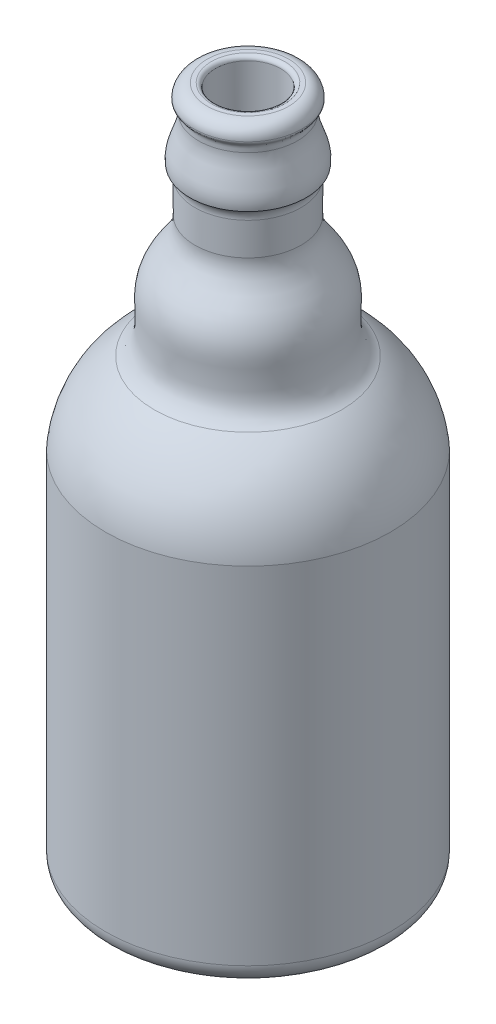
ISO-10303-21;
HEADER;
FILE_DESCRIPTION(('STEP AP214'),'2;1');
FILE_NAME('part.step','',(''),(''),'','','');
FILE_SCHEMA(('AUTOMOTIVE_DESIGN { 1 0 10303 214 1 1 1 1 }'));
ENDSEC;
DATA;
#1=APPLICATION_CONTEXT('core data for automotive mechanical design processes');
#2=APPLICATION_PROTOCOL_DEFINITION('international standard','automotive_design',2000,#1);
#3=PRODUCT_CONTEXT('',#1,'mechanical');
#4=PRODUCT('Part','Part','',(#3));
#5=PRODUCT_RELATED_PRODUCT_CATEGORY('part','',(#4));
#6=PRODUCT_DEFINITION_FORMATION('','',#4);
#7=PRODUCT_DEFINITION_CONTEXT('part definition',#1,'design');
#8=PRODUCT_DEFINITION('design','',#6,#7);
#9=PRODUCT_DEFINITION_SHAPE('','',#8);
#10=(LENGTH_UNIT() NAMED_UNIT(*) SI_UNIT(.MILLI.,.METRE.));
#11=(NAMED_UNIT(*) PLANE_ANGLE_UNIT() SI_UNIT($,.RADIAN.));
#12=(NAMED_UNIT(*) SI_UNIT($,.STERADIAN.) SOLID_ANGLE_UNIT());
#13=UNCERTAINTY_MEASURE_WITH_UNIT(LENGTH_MEASURE(1.E-05),#10,'distance_accuracy_value','');
#14=(GEOMETRIC_REPRESENTATION_CONTEXT(3) GLOBAL_UNCERTAINTY_ASSIGNED_CONTEXT((#13)) GLOBAL_UNIT_ASSIGNED_CONTEXT((#10,
#11,#12)) REPRESENTATION_CONTEXT('',''));
#15=CARTESIAN_POINT('',(0.,0.,0.));
#16=DIRECTION('',(0.,0.,1.));
#17=DIRECTION('',(1.,0.,0.));
#18=AXIS2_PLACEMENT_3D('',#15,#16,#17);
#19=CARTESIAN_POINT('',(0.,0.,0.));
#20=DIRECTION('',(0.,-1.,0.));
#21=DIRECTION('',(0.,0.,-1.));
#22=AXIS2_PLACEMENT_3D('',#19,#20,#21);
#23=PLANE('',#22);
#24=CARTESIAN_POINT('',(0.,0.,0.));
#25=DIRECTION('',(0.,1.,0.));
#26=DIRECTION('',(0.,0.,1.));
#27=AXIS2_PLACEMENT_3D('',#24,#25,#26);
#28=CIRCLE('',#27,30.);
#29=CARTESIAN_POINT('',(0.,0.,30.));
#30=VERTEX_POINT('',#29);
#31=EDGE_CURVE('E48',#30,#30,#28,.T.);
#32=ORIENTED_EDGE('',*,*,#31,.F.);
#33=EDGE_LOOP('',(#32));
#34=FACE_BOUND('',#33,.T.);
#35=ADVANCED_FACE('F37',(#34),#23,.T.);
#36=CARTESIAN_POINT('',(0.,5.,0.));
#37=DIRECTION('',(0.,1.,0.));
#38=DIRECTION('',(0.,0.,1.));
#39=AXIS2_PLACEMENT_3D('',#36,#37,#38);
#40=TOROIDAL_SURFACE('',#39,30.,5.);
#41=ORIENTED_EDGE('',*,*,#31,.T.);
#42=EDGE_LOOP('',(#41));
#43=FACE_BOUND('',#42,.T.);
#44=CARTESIAN_POINT('',(0.,5.,0.));
#45=DIRECTION('',(0.,1.,0.));
#46=DIRECTION('',(0.,0.,1.));
#47=AXIS2_PLACEMENT_3D('',#44,#45,#46);
#48=CIRCLE('',#47,35.);
#49=CARTESIAN_POINT('',(0.,5.,35.));
#50=VERTEX_POINT('',#49);
#51=EDGE_CURVE('E52',#50,#50,#48,.T.);
#52=ORIENTED_EDGE('',*,*,#51,.F.);
#53=EDGE_LOOP('',(#52));
#54=FACE_BOUND('',#53,.T.);
#55=ADVANCED_FACE('F114',(#43,#54),#40,.T.);
#56=CARTESIAN_POINT('',(0.,90.,0.));
#57=DIRECTION('',(0.,1.,0.));
#58=DIRECTION('',(0.,0.,1.));
#59=AXIS2_PLACEMENT_3D('',#56,#57,#58);
#60=CYLINDRICAL_SURFACE('',#59,35.);
#61=ORIENTED_EDGE('',*,*,#51,.T.);
#62=EDGE_LOOP('',(#61));
#63=FACE_BOUND('',#62,.T.);
#64=CARTESIAN_POINT('',(0.,90.,0.));
#65=DIRECTION('',(0.,1.,0.));
#66=DIRECTION('',(0.,0.,1.));
#67=AXIS2_PLACEMENT_3D('',#64,#65,#66);
#68=CIRCLE('',#67,35.);
#69=CARTESIAN_POINT('',(0.,90.,35.));
#70=VERTEX_POINT('',#69);
#71=EDGE_CURVE('E57',#70,#70,#68,.T.);
#72=ORIENTED_EDGE('',*,*,#71,.F.);
#73=EDGE_LOOP('',(#72));
#74=FACE_BOUND('',#73,.T.);
#75=ADVANCED_FACE('F110',(#63,#74),#60,.T.);
#76=CARTESIAN_POINT('',(0.,87.4712096260136,0.));
#77=DIRECTION('',(0.,1.,0.));
#78=DIRECTION('',(0.,0.,1.));
#79=AXIS2_PLACEMENT_3D('',#76,#77,#78);
#80=DEGENERATE_TOROIDAL_SURFACE('',#79,8.11868271002269,27.,.T.);
#81=ORIENTED_EDGE('',*,*,#71,.T.);
#82=EDGE_LOOP('',(#81));
#83=FACE_BOUND('',#82,.T.);
#84=CARTESIAN_POINT('',(0.,110.,0.));
#85=DIRECTION('',(0.,1.,0.));
#86=DIRECTION('',(0.,0.,1.));
#87=AXIS2_PLACEMENT_3D('',#84,#85,#86);
#88=CIRCLE('',#87,23.);
#89=CARTESIAN_POINT('',(0.,110.,23.));
#90=VERTEX_POINT('',#89);
#91=EDGE_CURVE('E60',#90,#90,#88,.T.);
#92=ORIENTED_EDGE('',*,*,#91,.F.);
#93=EDGE_LOOP('',(#92));
#94=FACE_BOUND('',#93,.T.);
#95=ADVANCED_FACE('F107',(#83,#94),#80,.T.);
#96=CARTESIAN_POINT('',(-13.,140.,0.));
#97=CARTESIAN_POINT('',(-12.7045310236833,136.13846316977,0.));
#98=CARTESIAN_POINT('',(-16.980222856119,132.156503830218,0.));
#99=CARTESIAN_POINT('',(-21.335513144288,122.025640538508,0.));
#100=CARTESIAN_POINT('',(-17.7844927531869,113.060883508352,0.));
#101=CARTESIAN_POINT('',(-23.,110.,0.));
#102=B_SPLINE_CURVE_WITH_KNOTS('',3,(#96,#97,#98,#99,#100,#101),.UNSPECIFIED.,.F.,.F.,(4,1,1,4),
(0.,0.315463765755963,0.514986069302217,1.),.UNSPECIFIED.);
#103=CARTESIAN_POINT('',(0.,140.,0.));
#104=DIRECTION('',(0.,1.,0.));
#105=AXIS1_PLACEMENT('',#103,#104);
#106=SURFACE_OF_REVOLUTION('',#102,#105);
#107=ORIENTED_EDGE('',*,*,#91,.T.);
#108=EDGE_LOOP('',(#107));
#109=FACE_BOUND('',#108,.T.);
#110=CARTESIAN_POINT('',(0.,140.,0.));
#111=DIRECTION('',(0.,1.,0.));
#112=DIRECTION('',(0.,0.,1.));
#113=AXIS2_PLACEMENT_3D('',#110,#111,#112);
#114=CIRCLE('',#113,13.);
#115=CARTESIAN_POINT('',(0.,140.,13.));
#116=VERTEX_POINT('',#115);
#117=EDGE_CURVE('E63',#116,#116,#114,.T.);
#118=ORIENTED_EDGE('',*,*,#117,.F.);
#119=EDGE_LOOP('',(#118));
#120=FACE_BOUND('',#119,.T.);
#121=ADVANCED_FACE('F105',(#109,#120),#106,.F.);
#122=CARTESIAN_POINT('',(0.,0.,0.));
#123=DIRECTION('',(0.,-1.,0.));
#124=DIRECTION('',(0.,0.,-1.));
#125=AXIS2_PLACEMENT_3D('',#122,#123,#124);
#126=CYLINDRICAL_SURFACE('',#125,13.);
#127=ORIENTED_EDGE('',*,*,#117,.T.);
#128=EDGE_LOOP('',(#127));
#129=FACE_BOUND('',#128,.T.);
#130=CARTESIAN_POINT('',(0.,148.,0.));
#131=DIRECTION('',(0.,-1.,0.));
#132=DIRECTION('',(0.,0.,-1.));
#133=AXIS2_PLACEMENT_3D('',#130,#131,#132);
#134=CIRCLE('',#133,13.);
#135=CARTESIAN_POINT('',(0.,148.,-13.));
#136=VERTEX_POINT('',#135);
#137=EDGE_CURVE('E66',#136,#136,#134,.T.);
#138=ORIENTED_EDGE('',*,*,#137,.T.);
#139=EDGE_LOOP('',(#138));
#140=FACE_BOUND('',#139,.T.);
#141=ADVANCED_FACE('F102',(#129,#140),#126,.T.);
#142=CARTESIAN_POINT('',(-14.3,150.775307346881,0.));
#143=CARTESIAN_POINT('',(-13.3308215452361,150.260847857195,0.));
#144=CARTESIAN_POINT('',(-12.9332480961433,149.041422290289,0.));
#145=CARTESIAN_POINT('',(-13.,148.,0.));
#146=B_SPLINE_CURVE_WITH_KNOTS('',3,(#142,#143,#144,#145),.UNSPECIFIED.,.F.,.F.,(4,4),(0.,1.),.UNSPECIFIED.);
#147=CARTESIAN_POINT('',(0.,148.,0.));
#148=DIRECTION('',(0.,-1.,0.));
#149=AXIS1_PLACEMENT('',#147,#148);
#150=SURFACE_OF_REVOLUTION('',#146,#149);
#151=ORIENTED_EDGE('',*,*,#137,.F.);
#152=EDGE_LOOP('',(#151));
#153=FACE_BOUND('',#152,.T.);
#154=CARTESIAN_POINT('',(0.,150.775307346881,0.));
#155=DIRECTION('',(0.,-1.,0.));
#156=DIRECTION('',(0.,0.,-1.));
#157=AXIS2_PLACEMENT_3D('',#154,#155,#156);
#158=CIRCLE('',#157,14.3);
#159=CARTESIAN_POINT('',(0.,150.775307346881,-14.3));
#160=VERTEX_POINT('',#159);
#161=EDGE_CURVE('E69',#160,#160,#158,.T.);
#162=ORIENTED_EDGE('',*,*,#161,.T.);
#163=EDGE_LOOP('',(#162));
#164=FACE_BOUND('',#163,.T.);
#165=ADVANCED_FACE('F99',(#153,#164),#150,.T.);
#166=CARTESIAN_POINT('',(-12.15,161.790763582258,0.));
#167=CARTESIAN_POINT('',(-12.0816044927341,157.916507354345,0.));
#168=CARTESIAN_POINT('',(-14.9925105292028,154.778829423521,0.));
#169=CARTESIAN_POINT('',(-14.3,150.775307346881,0.));
#170=B_SPLINE_CURVE_WITH_KNOTS('',3,(#166,#167,#168,#169),.UNSPECIFIED.,.F.,.F.,(4,4),(0.,1.),.UNSPECIFIED.);
#171=CARTESIAN_POINT('',(0.,148.,0.));
#172=DIRECTION('',(0.,-1.,0.));
#173=AXIS1_PLACEMENT('',#171,#172);
#174=SURFACE_OF_REVOLUTION('',#170,#173);
#175=ORIENTED_EDGE('',*,*,#161,.F.);
#176=EDGE_LOOP('',(#175));
#177=FACE_BOUND('',#176,.T.);
#178=CARTESIAN_POINT('',(0.,161.790763582258,0.));
#179=DIRECTION('',(0.,-1.,0.));
#180=DIRECTION('',(0.,0.,-1.));
#181=AXIS2_PLACEMENT_3D('',#178,#179,#180);
#182=CIRCLE('',#181,12.15);
#183=CARTESIAN_POINT('',(0.,161.790763582258,-12.15));
#184=VERTEX_POINT('',#183);
#185=EDGE_CURVE('E72',#184,#184,#182,.T.);
#186=ORIENTED_EDGE('',*,*,#185,.T.);
#187=EDGE_LOOP('',(#186));
#188=FACE_BOUND('',#187,.T.);
#189=ADVANCED_FACE('F94',(#177,#188),#174,.T.);
#190=CARTESIAN_POINT('',(-13.25,164.863260448559,0.));
#191=CARTESIAN_POINT('',(-13.2863609523831,164.193420258793,0.));
#192=CARTESIAN_POINT('',(-12.0016006485028,163.595655133462,0.));
#193=CARTESIAN_POINT('',(-12.1619033648901,162.291833797914,0.));
#194=CARTESIAN_POINT('',(-12.15,161.790763582258,0.));
#195=B_SPLINE_CURVE_WITH_KNOTS('',3,(#190,#191,#192,#193,#194),.UNSPECIFIED.,.F.,.F.,(4,1,4),
(0.,0.518087052169725,1.),.UNSPECIFIED.);
#196=CARTESIAN_POINT('',(0.,148.,0.));
#197=DIRECTION('',(0.,-1.,0.));
#198=AXIS1_PLACEMENT('',#196,#197);
#199=SURFACE_OF_REVOLUTION('',#195,#198);
#200=ORIENTED_EDGE('',*,*,#185,.F.);
#201=EDGE_LOOP('',(#200));
#202=FACE_BOUND('',#201,.T.);
#203=CARTESIAN_POINT('',(0.,164.863260448559,0.));
#204=DIRECTION('',(0.,-1.,0.));
#205=DIRECTION('',(0.,0.,-1.));
#206=AXIS2_PLACEMENT_3D('',#203,#204,#205);
#207=CIRCLE('',#206,13.25);
#208=CARTESIAN_POINT('',(0.,164.863260448559,-13.25));
#209=VERTEX_POINT('',#208);
#210=EDGE_CURVE('E75',#209,#209,#207,.T.);
#211=ORIENTED_EDGE('',*,*,#210,.T.);
#212=EDGE_LOOP('',(#211));
#213=FACE_BOUND('',#212,.T.);
#214=ADVANCED_FACE('F98',(#202,#213),#199,.T.);
#215=CARTESIAN_POINT('',(0.,164.863260448559,0.));
#216=DIRECTION('',(0.,-1.,0.));
#217=DIRECTION('',(0.,0.,-1.));
#218=AXIS2_PLACEMENT_3D('',#215,#216,#217);
#219=TOROIDAL_SURFACE('',#218,10.0224968663007,3.22750313369926);
#220=ORIENTED_EDGE('',*,*,#210,.F.);
#221=EDGE_LOOP('',(#220));
#222=FACE_BOUND('',#221,.T.);
#223=CARTESIAN_POINT('',(0.,168.090763582258,0.));
#224=DIRECTION('',(0.,-1.,0.));
#225=DIRECTION('',(0.,0.,-1.));
#226=AXIS2_PLACEMENT_3D('',#223,#224,#225);
#227=CIRCLE('',#226,10.0224968663007);
#228=CARTESIAN_POINT('',(0.,168.090763582258,-10.0224968663007));
#229=VERTEX_POINT('',#228);
#230=EDGE_CURVE('E78',#229,#229,#227,.T.);
#231=ORIENTED_EDGE('',*,*,#230,.T.);
#232=EDGE_LOOP('',(#231));
#233=FACE_BOUND('',#232,.T.);
#234=ADVANCED_FACE('F146',(#222,#233),#219,.T.);
#235=CARTESIAN_POINT('',(-10.0224968663007,168.090763582258,0.));
#236=DIRECTION('',(0.,-1.,0.));
#237=DIRECTION('',(0.,0.,-1.));
#238=AXIS2_PLACEMENT_3D('',#235,#236,#237);
#239=PLANE('',#238);
#240=CARTESIAN_POINT('',(0.,168.090763582258,0.));
#241=DIRECTION('',(0.,-1.,0.));
#242=DIRECTION('',(0.,0.,-1.));
#243=AXIS2_PLACEMENT_3D('',#240,#241,#242);
#244=CIRCLE('',#243,9.);
#245=CARTESIAN_POINT('',(0.,168.090763582258,-9.));
#246=VERTEX_POINT('',#245);
#247=EDGE_CURVE('E44',#246,#246,#244,.T.);
#248=ORIENTED_EDGE('',*,*,#247,.T.);
#249=EDGE_LOOP('',(#248));
#250=FACE_BOUND('',#249,.T.);
#251=ORIENTED_EDGE('',*,*,#230,.F.);
#252=EDGE_LOOP('',(#251));
#253=FACE_BOUND('',#252,.T.);
#254=ADVANCED_FACE('F151',(#250,#253),#239,.F.);
#255=CARTESIAN_POINT('',(0.,148.,0.));
#256=DIRECTION('',(0.,1.,0.));
#257=DIRECTION('',(0.,0.,1.));
#258=AXIS2_PLACEMENT_3D('',#255,#256,#257);
#259=CYLINDRICAL_SURFACE('',#258,8.);
#260=CARTESIAN_POINT('',(0.,167.090763582258,0.));
#261=DIRECTION('',(0.,-1.,0.));
#262=DIRECTION('',(0.,0.,-1.));
#263=AXIS2_PLACEMENT_3D('',#260,#261,#262);
#264=CIRCLE('',#263,8.);
#265=CARTESIAN_POINT('',(0.,167.090763582258,8.));
#266=VERTEX_POINT('',#265);
#267=EDGE_CURVE('E10',#266,#266,#264,.F.);
#268=CARTESIAN_POINT('',(0.,148.,0.));
#269=DIRECTION('',(0.,1.,0.));
#270=DIRECTION('',(0.,0.,1.));
#271=AXIS2_PLACEMENT_3D('',#268,#269,#270);
#272=CIRCLE('',#271,8.);
#273=CARTESIAN_POINT('',(0.,148.,8.));
#274=VERTEX_POINT('',#273);
#275=EDGE_CURVE('E81',#274,#274,#272,.T.);
#276=CARTESIAN_POINT('',(0.,167.090763582258,8.));
#277=CARTESIAN_POINT('',(0.,166.89190146161,8.));
#278=CARTESIAN_POINT('',(0.,166.693039340961,8.));
#279=CARTESIAN_POINT('',(0.,166.295315099664,8.));
#280=CARTESIAN_POINT('',(0.,166.096452979016,8.));
#281=CARTESIAN_POINT('',(0.,165.698728737718,8.));
#282=CARTESIAN_POINT('',(0.,165.49986661707,8.));
#283=CARTESIAN_POINT('',(0.,165.102142375773,8.));
#284=CARTESIAN_POINT('',(0.,164.903280255124,8.));
#285=CARTESIAN_POINT('',(0.,164.505556013827,8.));
#286=CARTESIAN_POINT('',(0.,164.306693893179,8.));
#287=CARTESIAN_POINT('',(0.,163.908969651882,8.));
#288=CARTESIAN_POINT('',(0.,163.710107531233,8.));
#289=CARTESIAN_POINT('',(0.,163.312383289936,8.));
#290=CARTESIAN_POINT('',(0.,163.113521169288,8.));
#291=CARTESIAN_POINT('',(0.,162.715796927991,8.));
#292=CARTESIAN_POINT('',(0.,162.516934807342,8.));
#293=CARTESIAN_POINT('',(0.,162.119210566045,8.));
#294=CARTESIAN_POINT('',(0.,161.920348445397,8.));
#295=CARTESIAN_POINT('',(0.,161.5226242041,8.));
#296=CARTESIAN_POINT('',(0.,161.323762083451,8.));
#297=CARTESIAN_POINT('',(0.,160.926037842154,8.));
#298=CARTESIAN_POINT('',(0.,160.727175721505,8.));
#299=CARTESIAN_POINT('',(0.,160.329451480208,8.));
#300=CARTESIAN_POINT('',(0.,160.13058935956,8.));
#301=CARTESIAN_POINT('',(0.,159.732865118263,8.));
#302=CARTESIAN_POINT('',(0.,159.534002997614,8.));
#303=CARTESIAN_POINT('',(0.,159.136278756317,8.));
#304=CARTESIAN_POINT('',(0.,158.937416635669,8.));
#305=CARTESIAN_POINT('',(0.,158.539692394372,8.));
#306=CARTESIAN_POINT('',(0.,158.340830273723,8.));
#307=CARTESIAN_POINT('',(0.,157.943106032426,8.));
#308=CARTESIAN_POINT('',(0.,157.744243911778,8.));
#309=CARTESIAN_POINT('',(0.,157.346519670481,8.));
#310=CARTESIAN_POINT('',(0.,157.147657549832,8.));
#311=CARTESIAN_POINT('',(0.,156.749933308535,8.));
#312=CARTESIAN_POINT('',(0.,156.551071187886,8.));
#313=CARTESIAN_POINT('',(0.,156.153346946589,8.));
#314=CARTESIAN_POINT('',(0.,155.954484825941,8.));
#315=CARTESIAN_POINT('',(0.,155.556760584644,8.));
#316=CARTESIAN_POINT('',(0.,155.357898463995,8.));
#317=CARTESIAN_POINT('',(0.,154.960174222698,8.));
#318=CARTESIAN_POINT('',(0.,154.76131210205,8.));
#319=CARTESIAN_POINT('',(0.,154.363587860753,8.));
#320=CARTESIAN_POINT('',(0.,154.164725740104,8.));
#321=CARTESIAN_POINT('',(0.,153.767001498807,8.));
#322=CARTESIAN_POINT('',(0.,153.568139378159,8.));
#323=CARTESIAN_POINT('',(0.,153.170415136862,8.));
#324=CARTESIAN_POINT('',(0.,152.971553016213,8.));
#325=CARTESIAN_POINT('',(0.,152.573828774916,8.));
#326=CARTESIAN_POINT('',(0.,152.374966654267,8.));
#327=CARTESIAN_POINT('',(0.,151.97724241297,8.));
#328=CARTESIAN_POINT('',(0.,151.778380292322,8.));
#329=CARTESIAN_POINT('',(0.,151.380656051025,8.));
#330=CARTESIAN_POINT('',(0.,151.181793930376,8.));
#331=CARTESIAN_POINT('',(0.,150.784069689079,8.));
#332=CARTESIAN_POINT('',(0.,150.585207568431,8.));
#333=CARTESIAN_POINT('',(0.,150.187483327134,8.));
#334=CARTESIAN_POINT('',(0.,149.988621206485,8.));
#335=CARTESIAN_POINT('',(0.,149.590896965188,8.));
#336=CARTESIAN_POINT('',(0.,149.39203484454,8.));
#337=CARTESIAN_POINT('',(0.,148.994310603243,8.));
#338=CARTESIAN_POINT('',(0.,148.795448482594,8.));
#339=CARTESIAN_POINT('',(0.,148.397724241297,8.));
#340=CARTESIAN_POINT('',(0.,148.198862120649,8.));
#341=CARTESIAN_POINT('',(0.,148.,8.));
#342=B_SPLINE_CURVE_WITH_KNOTS('',3,(#276,#277,#278,#279,#280,#281,#282,#283,#284,#285,#286,
#287,#288,#289,#290,#291,#292,#293,#294,#295,#296,#297,#298,#299,#300,#301,#302,#303,#304,#305,
#306,#307,#308,#309,#310,#311,#312,#313,#314,#315,#316,#317,#318,#319,#320,#321,#322,#323,#324,
#325,#326,#327,#328,#329,#330,#331,#332,#333,#334,#335,#336,#337,#338,#339,#340,#341),
.UNSPECIFIED.,.F.,.F.,(4,2,2,2,2,2,2,2,2,2,2,2,2,2,2,2,2,2,2,2,2,2,2,2,2,2,2,2,2,2,2,2,4),(0.,
0.596586361945567,1.19317272389113,1.7897590858367,2.38634544778227,2.98293180972783,
3.5795181716734,4.17610453361897,4.77269089556454,5.3692772575101,5.96586361945567,
6.56244998140124,7.1590363433468,7.75562270529237,8.35220906723794,8.9487954291835,
9.54538179112907,10.1419681530746,10.7385545150202,11.3351408769658,11.9317272389113,
12.5283136008569,13.1248999628025,13.721486324748,14.3180726866936,14.9146590486392,
15.5112454105847,16.1078317725303,16.7044181344759,17.3010044964214,17.897590858367,
18.4941772203126,19.0907635822581),.UNSPECIFIED.);
#343=EDGE_CURVE('BSEAM155',#266,#274,#342,.T.);
#344=ORIENTED_EDGE('',*,*,#267,.T.);
#345=ORIENTED_EDGE('',*,*,#275,.F.);
#346=ORIENTED_EDGE('',*,*,#343,.T.);
#347=ORIENTED_EDGE('',*,*,#343,.F.);
#348=EDGE_LOOP('',(#344,#346,#345,#347));
#349=FACE_BOUND('',#348,.T.);
#350=ADVANCED_FACE('F155',(#349),#259,.F.);
#351=CARTESIAN_POINT('',(0.,148.,0.));
#352=DIRECTION('',(0.,1.,0.));
#353=DIRECTION('',(0.,0.,1.));
#354=AXIS2_PLACEMENT_3D('',#351,#352,#353);
#355=PLANE('',#354);
#356=CARTESIAN_POINT('',(0.,148.,0.));
#357=DIRECTION('',(0.,-1.,0.));
#358=DIRECTION('',(0.,0.,-1.));
#359=AXIS2_PLACEMENT_3D('',#356,#357,#358);
#360=CIRCLE('',#359,7.99579955834314);
#361=CARTESIAN_POINT('',(0.,148.,-7.99579955834314));
#362=VERTEX_POINT('',#361);
#363=EDGE_CURVE('E179',#362,#362,#360,.T.);
#364=ORIENTED_EDGE('',*,*,#363,.T.);
#365=EDGE_LOOP('',(#364));
#366=FACE_BOUND('',#365,.T.);
#367=ORIENTED_EDGE('',*,*,#275,.T.);
#368=EDGE_LOOP('',(#367));
#369=FACE_BOUND('',#368,.T.);
#370=ADVANCED_FACE('F160',(#366,#369),#355,.T.);
#371=CARTESIAN_POINT('',(-14.3,150.775307346881,0.));
#372=CARTESIAN_POINT('',(-13.3308215452361,150.260847857195,0.));
#373=CARTESIAN_POINT('',(-12.9332480961433,149.041422290289,0.));
#374=CARTESIAN_POINT('',(-13.,148.,0.));
#375=B_SPLINE_CURVE_WITH_KNOTS('',3,(#371,#372,#373,#374),.UNSPECIFIED.,.F.,.F.,(4,4),(0.,1.),.UNSPECIFIED.);
#376=CARTESIAN_POINT('',(0.,148.,0.));
#377=DIRECTION('',(0.,-1.,0.));
#378=AXIS1_PLACEMENT('',#376,#377);
#379=SURFACE_OF_REVOLUTION('',#375,#378);
#380=OFFSET_SURFACE('',#379,-5.,.F.);
#381=CARTESIAN_POINT('',(0.,147.875130743827,0.));
#382=DIRECTION('',(0.,-1.,0.));
#383=DIRECTION('',(0.,0.,-1.));
#384=AXIS2_PLACEMENT_3D('',#381,#382,#383);
#385=CIRCLE('',#384,8.);
#386=CARTESIAN_POINT('',(0.,147.875130743827,-8.));
#387=VERTEX_POINT('',#386);
#388=EDGE_CURVE('E203',#387,#387,#385,.T.);
#389=ORIENTED_EDGE('',*,*,#388,.T.);
#390=EDGE_LOOP('',(#389));
#391=FACE_BOUND('',#390,.T.);
#392=ORIENTED_EDGE('',*,*,#363,.F.);
#393=EDGE_LOOP('',(#392));
#394=FACE_BOUND('',#393,.T.);
#395=ADVANCED_FACE('F164',(#391,#394),#380,.F.);
#396=CARTESIAN_POINT('',(0.,5.,0.));
#397=DIRECTION('',(0.,-1.,0.));
#398=DIRECTION('',(0.,0.,-1.));
#399=AXIS2_PLACEMENT_3D('',#396,#397,#398);
#400=PLANE('',#399);
#401=CARTESIAN_POINT('',(0.,5.,0.));
#402=DIRECTION('',(0.,-1.,0.));
#403=DIRECTION('',(0.,0.,-1.));
#404=AXIS2_PLACEMENT_3D('',#401,#402,#403);
#405=CIRCLE('',#404,30.);
#406=CARTESIAN_POINT('',(0.,5.,-30.));
#407=VERTEX_POINT('',#406);
#408=EDGE_CURVE('E184',#407,#407,#405,.T.);
#409=ORIENTED_EDGE('',*,*,#408,.F.);
#410=EDGE_LOOP('',(#409));
#411=FACE_BOUND('',#410,.T.);
#412=ADVANCED_FACE('F230',(#411),#400,.F.);
#413=CARTESIAN_POINT('',(0.,90.,0.));
#414=DIRECTION('',(0.,1.,0.));
#415=DIRECTION('',(0.,0.,1.));
#416=AXIS2_PLACEMENT_3D('',#413,#414,#415);
#417=CYLINDRICAL_SURFACE('',#416,30.);
#418=CARTESIAN_POINT('',(0.,89.753303764155,0.));
#419=DIRECTION('',(0.,-1.,0.));
#420=DIRECTION('',(0.,0.,-1.));
#421=AXIS2_PLACEMENT_3D('',#418,#419,#420);
#422=CIRCLE('',#421,30.);
#423=CARTESIAN_POINT('',(0.,89.753303764155,-30.));
#424=VERTEX_POINT('',#423);
#425=EDGE_CURVE('E191',#424,#424,#422,.F.);
#426=ORIENTED_EDGE('',*,*,#425,.T.);
#427=EDGE_LOOP('',(#426));
#428=FACE_BOUND('',#427,.T.);
#429=ORIENTED_EDGE('',*,*,#408,.T.);
#430=EDGE_LOOP('',(#429));
#431=FACE_BOUND('',#430,.T.);
#432=ADVANCED_FACE('F226',(#428,#431),#417,.F.);
#433=CARTESIAN_POINT('',(0.,87.4712096260136,0.));
#434=DIRECTION('',(0.,1.,0.));
#435=DIRECTION('',(0.,0.,1.));
#436=AXIS2_PLACEMENT_3D('',#433,#434,#435);
#437=DEGENERATE_TOROIDAL_SURFACE('',#436,8.11868271002269,22.,.T.);
#438=ORIENTED_EDGE('',*,*,#425,.F.);
#439=EDGE_LOOP('',(#438));
#440=FACE_BOUND('',#439,.T.);
#441=CARTESIAN_POINT('',(0.,105.767107962813,0.));
#442=DIRECTION('',(0.,1.,0.));
#443=DIRECTION('',(0.,0.,1.));
#444=AXIS2_PLACEMENT_3D('',#441,#442,#443);
#445=CIRCLE('',#444,20.3358879571114);
#446=CARTESIAN_POINT('',(0.,105.767107962813,20.3358879571114));
#447=VERTEX_POINT('',#446);
#448=EDGE_CURVE('E196',#447,#447,#445,.T.);
#449=ORIENTED_EDGE('',*,*,#448,.T.);
#450=EDGE_LOOP('',(#449));
#451=FACE_BOUND('',#450,.T.);
#452=ADVANCED_FACE('F218',(#440,#451),#437,.F.);
#453=CARTESIAN_POINT('',(-13.,140.,0.));
#454=CARTESIAN_POINT('',(-12.7045310236833,136.13846316977,0.));
#455=CARTESIAN_POINT('',(-16.980222856119,132.156503830218,0.));
#456=CARTESIAN_POINT('',(-21.335513144288,122.025640538508,0.));
#457=CARTESIAN_POINT('',(-17.7844927531869,113.060883508352,0.));
#458=CARTESIAN_POINT('',(-23.,110.,0.));
#459=B_SPLINE_CURVE_WITH_KNOTS('',3,(#453,#454,#455,#456,#457,#458),.UNSPECIFIED.,.F.,.F.,(4,1,
1,4),(0.,0.315463765755963,0.514986069302217,1.),.UNSPECIFIED.);
#460=CARTESIAN_POINT('',(0.,140.,0.));
#461=DIRECTION('',(0.,1.,0.));
#462=AXIS1_PLACEMENT('',#460,#461);
#463=SURFACE_OF_REVOLUTION('',#459,#462);
#464=OFFSET_SURFACE('',#463,5.,.F.);
#465=ORIENTED_EDGE('',*,*,#448,.F.);
#466=EDGE_LOOP('',(#465));
#467=FACE_BOUND('',#466,.T.);
#468=CARTESIAN_POINT('',(0.,140.167921451435,0.));
#469=DIRECTION('',(0.,1.,0.));
#470=DIRECTION('',(0.,0.,1.));
#471=AXIS2_PLACEMENT_3D('',#468,#469,#470);
#472=CIRCLE('',#471,8.);
#473=CARTESIAN_POINT('',(0.,140.167921451435,8.));
#474=VERTEX_POINT('',#473);
#475=EDGE_CURVE('E201',#474,#474,#472,.T.);
#476=ORIENTED_EDGE('',*,*,#475,.T.);
#477=EDGE_LOOP('',(#476));
#478=FACE_BOUND('',#477,.T.);
#479=ADVANCED_FACE('F211',(#467,#478),#464,.T.);
#480=CARTESIAN_POINT('',(0.,0.,0.));
#481=DIRECTION('',(0.,-1.,0.));
#482=DIRECTION('',(0.,0.,-1.));
#483=AXIS2_PLACEMENT_3D('',#480,#481,#482);
#484=CYLINDRICAL_SURFACE('',#483,8.);
#485=ORIENTED_EDGE('',*,*,#475,.F.);
#486=EDGE_LOOP('',(#485));
#487=FACE_BOUND('',#486,.T.);
#488=ORIENTED_EDGE('',*,*,#388,.F.);
#489=EDGE_LOOP('',(#488));
#490=FACE_BOUND('',#489,.T.);
#491=ADVANCED_FACE('F209',(#487,#490),#484,.F.);
#492=CARTESIAN_POINT('',(0.,167.090763582258,0.));
#493=DIRECTION('',(0.,-1.,0.));
#494=DIRECTION('',(0.,0.,-1.));
#495=AXIS2_PLACEMENT_3D('',#492,#493,#494);
#496=TOROIDAL_SURFACE('',#495,9.,1.);
#497=ORIENTED_EDGE('',*,*,#267,.F.);
#498=EDGE_LOOP('',(#497));
#499=FACE_BOUND('',#498,.T.);
#500=ORIENTED_EDGE('',*,*,#247,.F.);
#501=EDGE_LOOP('',(#500));
#502=FACE_BOUND('',#501,.T.);
#503=ADVANCED_FACE('F39',(#499,#502),#496,.T.);
#504=CLOSED_SHELL('',(#35,#55,#75,#95,#121,#141,#165,#189,#214,#234,#254,#350,#370,#395,#412,
#432,#452,#479,#491,#503));
#505=MANIFOLD_SOLID_BREP('B2',#504);
#506=ADVANCED_BREP_SHAPE_REPRESENTATION('',(#18,#505),#14);
#507=SHAPE_DEFINITION_REPRESENTATION(#9,#506);
ENDSEC;
END-ISO-10303-21;
